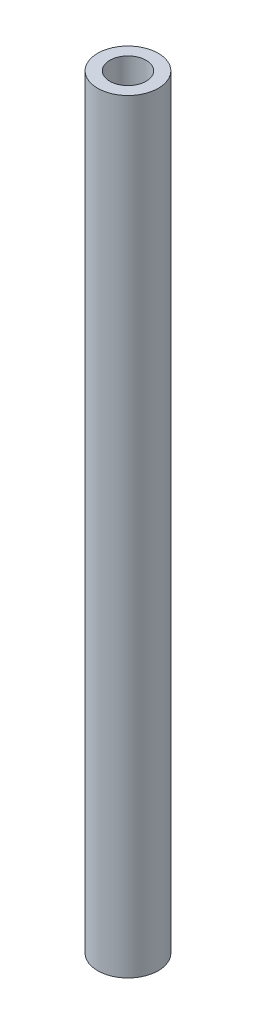
ISO-10303-21;
HEADER;
FILE_DESCRIPTION(('STEP AP214'),'2;1');
FILE_NAME('part.step','',(''),(''),'','','');
FILE_SCHEMA(('AUTOMOTIVE_DESIGN { 1 0 10303 214 1 1 1 1 }'));
ENDSEC;
DATA;
#1=APPLICATION_CONTEXT('core data for automotive mechanical design processes');
#2=APPLICATION_PROTOCOL_DEFINITION('international standard','automotive_design',2000,#1);
#3=PRODUCT_CONTEXT('',#1,'mechanical');
#4=PRODUCT('Part','Part','',(#3));
#5=PRODUCT_RELATED_PRODUCT_CATEGORY('part','',(#4));
#6=PRODUCT_DEFINITION_FORMATION('','',#4);
#7=PRODUCT_DEFINITION_CONTEXT('part definition',#1,'design');
#8=PRODUCT_DEFINITION('design','',#6,#7);
#9=PRODUCT_DEFINITION_SHAPE('','',#8);
#10=(LENGTH_UNIT() NAMED_UNIT(*) SI_UNIT(.MILLI.,.METRE.));
#11=(NAMED_UNIT(*) PLANE_ANGLE_UNIT() SI_UNIT($,.RADIAN.));
#12=(NAMED_UNIT(*) SI_UNIT($,.STERADIAN.) SOLID_ANGLE_UNIT());
#13=UNCERTAINTY_MEASURE_WITH_UNIT(LENGTH_MEASURE(1.E-05),#10,'distance_accuracy_value','');
#14=(GEOMETRIC_REPRESENTATION_CONTEXT(3) GLOBAL_UNCERTAINTY_ASSIGNED_CONTEXT((#13)) GLOBAL_UNIT_ASSIGNED_CONTEXT((#10,
#11,#12)) REPRESENTATION_CONTEXT('',''));
#15=CARTESIAN_POINT('',(0.,0.,0.));
#16=DIRECTION('',(0.,0.,1.));
#17=DIRECTION('',(1.,0.,0.));
#18=AXIS2_PLACEMENT_3D('',#15,#16,#17);
#19=CARTESIAN_POINT('',(0.,63.,0.));
#20=DIRECTION('',(0.,1.,0.));
#21=DIRECTION('',(0.,0.,1.));
#22=AXIS2_PLACEMENT_3D('',#19,#20,#21);
#23=PLANE('',#22);
#24=CARTESIAN_POINT('',(0.,63.,0.));
#25=DIRECTION('',(0.,1.,0.));
#26=DIRECTION('',(0.,0.,1.));
#27=AXIS2_PLACEMENT_3D('',#24,#25,#26);
#28=CIRCLE('',#27,2.5);
#29=CARTESIAN_POINT('',(0.,63.,2.5));
#30=VERTEX_POINT('',#29);
#31=EDGE_CURVE('E10',#30,#30,#28,.T.);
#32=ORIENTED_EDGE('',*,*,#31,.T.);
#33=EDGE_LOOP('',(#32));
#34=FACE_BOUND('',#33,.T.);
#35=CARTESIAN_POINT('',(0.,63.,0.));
#36=DIRECTION('',(0.,1.,0.));
#37=DIRECTION('',(0.,0.,1.));
#38=AXIS2_PLACEMENT_3D('',#35,#36,#37);
#39=CIRCLE('',#38,1.5);
#40=CARTESIAN_POINT('',(0.,63.,1.5));
#41=VERTEX_POINT('',#40);
#42=EDGE_CURVE('E44',#41,#41,#39,.T.);
#43=ORIENTED_EDGE('',*,*,#42,.F.);
#44=EDGE_LOOP('',(#43));
#45=FACE_BOUND('',#44,.T.);
#46=ADVANCED_FACE('F33',(#34,#45),#23,.T.);
#47=CARTESIAN_POINT('',(0.,0.,0.));
#48=DIRECTION('',(0.,1.,0.));
#49=DIRECTION('',(0.,0.,1.));
#50=AXIS2_PLACEMENT_3D('',#47,#48,#49);
#51=PLANE('',#50);
#52=CARTESIAN_POINT('',(0.,0.,0.));
#53=DIRECTION('',(0.,1.,0.));
#54=DIRECTION('',(0.,0.,1.));
#55=AXIS2_PLACEMENT_3D('',#52,#53,#54);
#56=CIRCLE('',#55,2.5);
#57=CARTESIAN_POINT('',(0.,0.,2.5));
#58=VERTEX_POINT('',#57);
#59=EDGE_CURVE('E37',#58,#58,#56,.T.);
#60=ORIENTED_EDGE('',*,*,#59,.F.);
#61=EDGE_LOOP('',(#60));
#62=FACE_BOUND('',#61,.T.);
#63=CARTESIAN_POINT('',(0.,0.,0.));
#64=DIRECTION('',(0.,1.,0.));
#65=DIRECTION('',(0.,0.,1.));
#66=AXIS2_PLACEMENT_3D('',#63,#64,#65);
#67=CIRCLE('',#66,1.5);
#68=CARTESIAN_POINT('',(0.,0.,1.5));
#69=VERTEX_POINT('',#68);
#70=EDGE_CURVE('E46',#69,#69,#67,.T.);
#71=ORIENTED_EDGE('',*,*,#70,.T.);
#72=EDGE_LOOP('',(#71));
#73=FACE_BOUND('',#72,.T.);
#74=ADVANCED_FACE('F56',(#62,#73),#51,.F.);
#75=CARTESIAN_POINT('',(0.,63.,0.));
#76=DIRECTION('',(0.,-1.,0.));
#77=DIRECTION('',(0.,0.,-1.));
#78=AXIS2_PLACEMENT_3D('',#75,#76,#77);
#79=CYLINDRICAL_SURFACE('',#78,2.5);
#80=ORIENTED_EDGE('',*,*,#31,.F.);
#81=EDGE_LOOP('',(#80));
#82=FACE_BOUND('',#81,.T.);
#83=ORIENTED_EDGE('',*,*,#59,.T.);
#84=EDGE_LOOP('',(#83));
#85=FACE_BOUND('',#84,.T.);
#86=ADVANCED_FACE('F35',(#82,#85),#79,.T.);
#87=CARTESIAN_POINT('',(0.,63.,0.));
#88=DIRECTION('',(0.,-1.,0.));
#89=DIRECTION('',(0.,0.,-1.));
#90=AXIS2_PLACEMENT_3D('',#87,#88,#89);
#91=CYLINDRICAL_SURFACE('',#90,1.5);
#92=ORIENTED_EDGE('',*,*,#42,.T.);
#93=EDGE_LOOP('',(#92));
#94=FACE_BOUND('',#93,.T.);
#95=ORIENTED_EDGE('',*,*,#70,.F.);
#96=EDGE_LOOP('',(#95));
#97=FACE_BOUND('',#96,.T.);
#98=ADVANCED_FACE('F52',(#94,#97),#91,.F.);
#99=CLOSED_SHELL('',(#46,#74,#86,#98));
#100=MANIFOLD_SOLID_BREP('B2',#99);
#101=ADVANCED_BREP_SHAPE_REPRESENTATION('',(#18,#100),#14);
#102=SHAPE_DEFINITION_REPRESENTATION(#9,#101);
ENDSEC;
END-ISO-10303-21;
